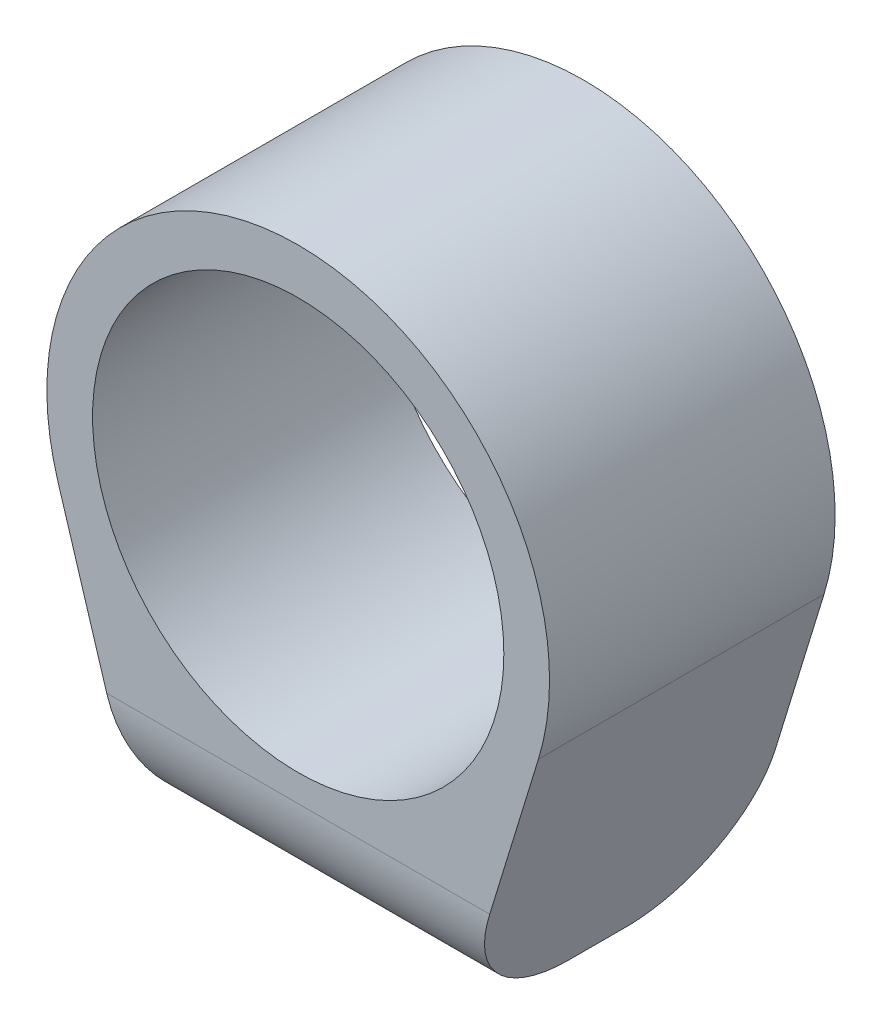
ISO-10303-21;
HEADER;
FILE_DESCRIPTION(('STEP AP214'),'2;1');
FILE_NAME('part.step','',(''),(''),'','','');
FILE_SCHEMA(('AUTOMOTIVE_DESIGN { 1 0 10303 214 1 1 1 1 }'));
ENDSEC;
DATA;
#1=APPLICATION_CONTEXT('core data for automotive mechanical design processes');
#2=APPLICATION_PROTOCOL_DEFINITION('international standard','automotive_design',2000,#1);
#3=PRODUCT_CONTEXT('',#1,'mechanical');
#4=PRODUCT('Part','Part','',(#3));
#5=PRODUCT_RELATED_PRODUCT_CATEGORY('part','',(#4));
#6=PRODUCT_DEFINITION_FORMATION('','',#4);
#7=PRODUCT_DEFINITION_CONTEXT('part definition',#1,'design');
#8=PRODUCT_DEFINITION('design','',#6,#7);
#9=PRODUCT_DEFINITION_SHAPE('','',#8);
#10=(LENGTH_UNIT() NAMED_UNIT(*) SI_UNIT(.MILLI.,.METRE.));
#11=(NAMED_UNIT(*) PLANE_ANGLE_UNIT() SI_UNIT($,.RADIAN.));
#12=(NAMED_UNIT(*) SI_UNIT($,.STERADIAN.) SOLID_ANGLE_UNIT());
#13=UNCERTAINTY_MEASURE_WITH_UNIT(LENGTH_MEASURE(1.E-05),#10,'distance_accuracy_value','');
#14=(GEOMETRIC_REPRESENTATION_CONTEXT(3) GLOBAL_UNCERTAINTY_ASSIGNED_CONTEXT((#13)) GLOBAL_UNIT_ASSIGNED_CONTEXT((#10,
#11,#12)) REPRESENTATION_CONTEXT('',''));
#15=CARTESIAN_POINT('',(0.,0.,0.));
#16=DIRECTION('',(0.,0.,1.));
#17=DIRECTION('',(1.,0.,0.));
#18=AXIS2_PLACEMENT_3D('',#15,#16,#17);
#19=CARTESIAN_POINT('',(-13.6950192477342,-30.3553363974803,25.));
#20=DIRECTION('',(0.,1.,0.));
#21=DIRECTION('',(-1.,0.,0.));
#22=AXIS2_PLACEMENT_3D('',#19,#20,#21);
#23=PLANE('',#22);
#24=DIRECTION('',(0.,0.,-1.));
#25=VECTOR('',#24,1.);
#26=CARTESIAN_POINT('',(-13.6950192477342,-30.3553363974803,25.));
#27=LINE('',#26,#25);
#28=CARTESIAN_POINT('',(-13.6950192477342,-30.3553363974803,15.));
#29=VERTEX_POINT('',#28);
#30=CARTESIAN_POINT('',(-13.6950192477342,-30.3553363974803,10.));
#31=VERTEX_POINT('',#30);
#32=EDGE_CURVE('E122',#29,#31,#27,.T.);
#33=ORIENTED_EDGE('',*,*,#32,.T.);
#34=DIRECTION('',(1.,0.,0.));
#35=VECTOR('',#34,1.);
#36=CARTESIAN_POINT('',(-13.6950192477342,-30.3553363974803,10.));
#37=LINE('',#36,#35);
#38=CARTESIAN_POINT('',(-4.5,-30.3553363974803,10.));
#39=VERTEX_POINT('',#38);
#40=EDGE_CURVE('E138',#31,#39,#37,.T.);
#41=ORIENTED_EDGE('',*,*,#40,.T.);
#42=CARTESIAN_POINT('',(-4.5,-30.3553363974803,12.5));
#43=DIRECTION('',(0.,-1.,0.));
#44=DIRECTION('',(1.,0.,0.));
#45=AXIS2_PLACEMENT_3D('',#42,#43,#44);
#46=CIRCLE('',#45,2.5);
#47=CARTESIAN_POINT('',(-4.5,-30.3553363974803,15.));
#48=VERTEX_POINT('',#47);
#49=EDGE_CURVE('E199',#48,#39,#46,.T.);
#50=ORIENTED_EDGE('',*,*,#49,.F.);
#51=DIRECTION('',(1.,0.,0.));
#52=VECTOR('',#51,1.);
#53=CARTESIAN_POINT('',(-13.6950192477342,-30.3553363974803,15.));
#54=LINE('',#53,#52);
#55=EDGE_CURVE('E121',#48,#29,#54,.F.);
#56=ORIENTED_EDGE('',*,*,#55,.T.);
#57=EDGE_LOOP('',(#33,#41,#50,#56));
#58=FACE_BOUND('',#57,.T.);
#59=ADVANCED_FACE('F33',(#58),#23,.F.);
#60=EDGE_CURVE('E165',#39,#48,#46,.T.);
#61=ORIENTED_EDGE('',*,*,#60,.F.);
#62=DIRECTION('',(1.,0.,0.));
#63=VECTOR('',#62,1.);
#64=CARTESIAN_POINT('',(-13.6950192477342,-30.3553363974803,10.));
#65=LINE('',#64,#63);
#66=CARTESIAN_POINT('',(4.5,-30.3553363974803,10.));
#67=VERTEX_POINT('',#66);
#68=EDGE_CURVE('E136',#39,#67,#65,.T.);
#69=ORIENTED_EDGE('',*,*,#68,.T.);
#70=CARTESIAN_POINT('',(4.5,-30.3553363974803,12.5));
#71=DIRECTION('',(0.,-1.,0.));
#72=DIRECTION('',(1.,0.,0.));
#73=AXIS2_PLACEMENT_3D('',#70,#71,#72);
#74=CIRCLE('',#73,2.5);
#75=CARTESIAN_POINT('',(4.5,-30.3553363974803,15.));
#76=VERTEX_POINT('',#75);
#77=EDGE_CURVE('E162',#76,#67,#74,.T.);
#78=ORIENTED_EDGE('',*,*,#77,.F.);
#79=DIRECTION('',(1.,0.,0.));
#80=VECTOR('',#79,1.);
#81=CARTESIAN_POINT('',(-13.6950192477342,-30.3553363974803,15.));
#82=LINE('',#81,#80);
#83=EDGE_CURVE('E124',#76,#48,#82,.F.);
#84=ORIENTED_EDGE('',*,*,#83,.T.);
#85=EDGE_LOOP('',(#61,#69,#78,#84));
#86=FACE_BOUND('',#85,.T.);
#87=ADVANCED_FACE('F160',(#86),#23,.F.);
#88=CARTESIAN_POINT('',(0.,0.,25.));
#89=DIRECTION('',(0.,0.,1.));
#90=DIRECTION('',(1.,0.,0.));
#91=AXIS2_PLACEMENT_3D('',#88,#89,#90);
#92=PLANE('',#91);
#93=DIRECTION('',(0.293455292652128,-0.955972798365337,0.));
#94=VECTOR('',#93,1.);
#95=CARTESIAN_POINT('',(-21.0314015640374,-6.45601643834682,25.));
#96=LINE('',#95,#94);
#97=CARTESIAN_POINT('',(-21.0314015640374,-6.45601643834682,25.));
#98=VERTEX_POINT('',#97);
#99=CARTESIAN_POINT('',(-16.7647226237499,-20.3553363974803,25.));
#100=VERTEX_POINT('',#99);
#101=EDGE_CURVE('E98',#98,#100,#96,.T.);
#102=ORIENTED_EDGE('',*,*,#101,.T.);
#103=DIRECTION('',(1.,0.,0.));
#104=VECTOR('',#103,1.);
#105=CARTESIAN_POINT('',(13.6950192477342,-20.3553363974803,25.));
#106=LINE('',#105,#104);
#107=CARTESIAN_POINT('',(16.7647226237499,-20.3553363974803,25.));
#108=VERTEX_POINT('',#107);
#109=EDGE_CURVE('E11',#100,#108,#106,.T.);
#110=ORIENTED_EDGE('',*,*,#109,.T.);
#111=DIRECTION('',(0.293455292652128,0.955972798365337,0.));
#112=VECTOR('',#111,1.);
#113=CARTESIAN_POINT('',(21.0314015640374,-6.45601643834682,25.));
#114=LINE('',#113,#112);
#115=CARTESIAN_POINT('',(21.0314015640374,-6.45601643834682,25.));
#116=VERTEX_POINT('',#115);
#117=EDGE_CURVE('E106',#108,#116,#114,.T.);
#118=ORIENTED_EDGE('',*,*,#117,.T.);
#119=CARTESIAN_POINT('',(0.,0.,25.));
#120=DIRECTION('',(0.,0.,1.));
#121=DIRECTION('',(1.,0.,0.));
#122=AXIS2_PLACEMENT_3D('',#119,#120,#121);
#123=CIRCLE('',#122,22.);
#124=EDGE_CURVE('E107',#116,#98,#123,.T.);
#125=ORIENTED_EDGE('',*,*,#124,.T.);
#126=EDGE_LOOP('',(#102,#110,#118,#125));
#127=FACE_BOUND('',#126,.T.);
#128=CARTESIAN_POINT('',(0.,0.,25.));
#129=DIRECTION('',(0.,0.,1.));
#130=DIRECTION('',(1.,0.,0.));
#131=AXIS2_PLACEMENT_3D('',#128,#129,#130);
#132=CIRCLE('',#131,18.);
#133=CARTESIAN_POINT('',(18.,0.,25.));
#134=VERTEX_POINT('',#133);
#135=EDGE_CURVE('E182',#134,#134,#132,.T.);
#136=ORIENTED_EDGE('',*,*,#135,.F.);
#137=EDGE_LOOP('',(#136));
#138=FACE_BOUND('',#137,.T.);
#139=ADVANCED_FACE('F110',(#127,#138),#92,.T.);
#140=CARTESIAN_POINT('',(0.,0.,0.));
#141=DIRECTION('',(0.,0.,1.));
#142=DIRECTION('',(1.,0.,0.));
#143=AXIS2_PLACEMENT_3D('',#140,#141,#142);
#144=PLANE('',#143);
#145=DIRECTION('',(0.293455292652128,0.955972798365337,0.));
#146=VECTOR('',#145,1.);
#147=CARTESIAN_POINT('',(21.0314015640374,-6.45601643834682,0.));
#148=LINE('',#147,#146);
#149=CARTESIAN_POINT('',(16.7647226237499,-20.3553363974803,0.));
#150=VERTEX_POINT('',#149);
#151=CARTESIAN_POINT('',(21.0314015640374,-6.45601643834682,0.));
#152=VERTEX_POINT('',#151);
#153=EDGE_CURVE('E116',#150,#152,#148,.T.);
#154=ORIENTED_EDGE('',*,*,#153,.F.);
#155=DIRECTION('',(1.,0.,0.));
#156=VECTOR('',#155,1.);
#157=CARTESIAN_POINT('',(0.,-20.3553363974803,0.));
#158=LINE('',#157,#156);
#159=CARTESIAN_POINT('',(-16.7647226237499,-20.3553363974803,0.));
#160=VERTEX_POINT('',#159);
#161=EDGE_CURVE('E56',#150,#160,#158,.F.);
#162=ORIENTED_EDGE('',*,*,#161,.T.);
#163=DIRECTION('',(0.293455292652128,-0.955972798365337,0.));
#164=VECTOR('',#163,1.);
#165=CARTESIAN_POINT('',(-21.0314015640374,-6.45601643834682,0.));
#166=LINE('',#165,#164);
#167=CARTESIAN_POINT('',(-21.0314015640374,-6.45601643834682,0.));
#168=VERTEX_POINT('',#167);
#169=EDGE_CURVE('E147',#168,#160,#166,.T.);
#170=ORIENTED_EDGE('',*,*,#169,.F.);
#171=CARTESIAN_POINT('',(0.,0.,0.));
#172=DIRECTION('',(0.,0.,1.));
#173=DIRECTION('',(1.,0.,0.));
#174=AXIS2_PLACEMENT_3D('',#171,#172,#173);
#175=CIRCLE('',#174,22.);
#176=EDGE_CURVE('E120',#152,#168,#175,.T.);
#177=ORIENTED_EDGE('',*,*,#176,.F.);
#178=EDGE_LOOP('',(#154,#162,#170,#177));
#179=FACE_BOUND('',#178,.T.);
#180=CARTESIAN_POINT('',(0.,0.,0.));
#181=DIRECTION('',(0.,0.,1.));
#182=DIRECTION('',(1.,0.,0.));
#183=AXIS2_PLACEMENT_3D('',#180,#181,#182);
#184=CIRCLE('',#183,18.);
#185=CARTESIAN_POINT('',(18.,0.,0.));
#186=VERTEX_POINT('',#185);
#187=EDGE_CURVE('E185',#186,#186,#184,.T.);
#188=ORIENTED_EDGE('',*,*,#187,.T.);
#189=EDGE_LOOP('',(#188));
#190=FACE_BOUND('',#189,.T.);
#191=ADVANCED_FACE('F232',(#179,#190),#144,.F.);
#192=CARTESIAN_POINT('',(0.,0.,25.));
#193=DIRECTION('',(0.,0.,-1.));
#194=DIRECTION('',(-1.,0.,0.));
#195=AXIS2_PLACEMENT_3D('',#192,#193,#194);
#196=CYLINDRICAL_SURFACE('',#195,22.);
#197=ORIENTED_EDGE('',*,*,#176,.T.);
#198=DIRECTION('',(0.,0.,-1.));
#199=VECTOR('',#198,1.);
#200=CARTESIAN_POINT('',(-21.0314015640374,-6.45601643834682,25.));
#201=LINE('',#200,#199);
#202=EDGE_CURVE('E102',#98,#168,#201,.T.);
#203=ORIENTED_EDGE('',*,*,#202,.F.);
#204=ORIENTED_EDGE('',*,*,#124,.F.);
#205=DIRECTION('',(0.,0.,-1.));
#206=VECTOR('',#205,1.);
#207=CARTESIAN_POINT('',(21.0314015640374,-6.45601643834682,25.));
#208=LINE('',#207,#206);
#209=EDGE_CURVE('E190',#116,#152,#208,.T.);
#210=ORIENTED_EDGE('',*,*,#209,.T.);
#211=EDGE_LOOP('',(#197,#203,#204,#210));
#212=FACE_BOUND('',#211,.T.);
#213=ADVANCED_FACE('F118',(#212),#196,.T.);
#214=CARTESIAN_POINT('',(-21.0314015640374,-6.45601643834682,25.));
#215=DIRECTION('',(0.955972798365337,0.293455292652128,0.));
#216=DIRECTION('',(-0.293455292652128,0.955972798365337,0.));
#217=AXIS2_PLACEMENT_3D('',#214,#215,#216);
#218=PLANE('',#217);
#219=ORIENTED_EDGE('',*,*,#169,.T.);
#220=CARTESIAN_POINT('',(-16.7647226237499,-20.3553363974803,10.));
#221=DIRECTION('',(0.955972798365337,0.293455292652128,0.));
#222=DIRECTION('',(0.293455292652128,-0.955972798365337,0.));
#223=AXIS2_PLACEMENT_3D('',#220,#221,#222);
#224=ELLIPSE('',#223,10.4605486862173,10.);
#225=EDGE_CURVE('E41',#160,#31,#224,.F.);
#226=ORIENTED_EDGE('',*,*,#225,.T.);
#227=ORIENTED_EDGE('',*,*,#32,.F.);
#228=CARTESIAN_POINT('',(-16.7647226237499,-20.3553363974803,15.));
#229=DIRECTION('',(0.955972798365337,0.293455292652128,0.));
#230=DIRECTION('',(-0.293455292652128,0.955972798365337,0.));
#231=AXIS2_PLACEMENT_3D('',#228,#229,#230);
#232=ELLIPSE('',#231,10.4605486862173,10.);
#233=EDGE_CURVE('E48',#29,#100,#232,.F.);
#234=ORIENTED_EDGE('',*,*,#233,.T.);
#235=ORIENTED_EDGE('',*,*,#101,.F.);
#236=ORIENTED_EDGE('',*,*,#202,.T.);
#237=EDGE_LOOP('',(#219,#226,#227,#234,#235,#236));
#238=FACE_BOUND('',#237,.T.);
#239=ADVANCED_FACE('F100',(#238),#218,.F.);
#240=EDGE_CURVE('E169',#67,#76,#74,.T.);
#241=ORIENTED_EDGE('',*,*,#240,.F.);
#242=DIRECTION('',(1.,0.,0.));
#243=VECTOR('',#242,1.);
#244=CARTESIAN_POINT('',(-13.6950192477342,-30.3553363974803,10.));
#245=LINE('',#244,#243);
#246=CARTESIAN_POINT('',(13.6950192477342,-30.3553363974803,10.));
#247=VERTEX_POINT('',#246);
#248=EDGE_CURVE('E134',#67,#247,#245,.T.);
#249=ORIENTED_EDGE('',*,*,#248,.T.);
#250=DIRECTION('',(0.,0.,-1.));
#251=VECTOR('',#250,1.);
#252=CARTESIAN_POINT('',(13.6950192477342,-30.3553363974803,25.));
#253=LINE('',#252,#251);
#254=CARTESIAN_POINT('',(13.6950192477342,-30.3553363974803,15.));
#255=VERTEX_POINT('',#254);
#256=EDGE_CURVE('E127',#255,#247,#253,.T.);
#257=ORIENTED_EDGE('',*,*,#256,.F.);
#258=DIRECTION('',(1.,0.,0.));
#259=VECTOR('',#258,1.);
#260=CARTESIAN_POINT('',(-13.6950192477342,-30.3553363974803,15.));
#261=LINE('',#260,#259);
#262=EDGE_CURVE('E132',#255,#76,#261,.F.);
#263=ORIENTED_EDGE('',*,*,#262,.T.);
#264=EDGE_LOOP('',(#241,#249,#257,#263));
#265=FACE_BOUND('',#264,.T.);
#266=ADVANCED_FACE('F170',(#265),#23,.F.);
#267=CARTESIAN_POINT('',(21.0314015640374,-6.45601643834682,25.));
#268=DIRECTION('',(-0.955972798365337,0.293455292652128,0.));
#269=DIRECTION('',(-0.293455292652128,-0.955972798365337,0.));
#270=AXIS2_PLACEMENT_3D('',#267,#268,#269);
#271=PLANE('',#270);
#272=ORIENTED_EDGE('',*,*,#256,.T.);
#273=CARTESIAN_POINT('',(16.76472262375,-20.3553363974802,10.));
#274=DIRECTION('',(-0.955972798365337,0.293455292652128,0.));
#275=DIRECTION('',(0.293455292652128,0.955972798365337,0.));
#276=AXIS2_PLACEMENT_3D('',#273,#274,#275);
#277=ELLIPSE('',#276,10.4605486862173,10.);
#278=EDGE_CURVE('E143',#247,#150,#277,.F.);
#279=ORIENTED_EDGE('',*,*,#278,.T.);
#280=ORIENTED_EDGE('',*,*,#153,.T.);
#281=ORIENTED_EDGE('',*,*,#209,.F.);
#282=ORIENTED_EDGE('',*,*,#117,.F.);
#283=CARTESIAN_POINT('',(16.7647226237499,-20.3553363974802,15.));
#284=DIRECTION('',(-0.955972798365337,0.293455292652128,0.));
#285=DIRECTION('',(-0.293455292652128,-0.955972798365337,0.));
#286=AXIS2_PLACEMENT_3D('',#283,#284,#285);
#287=ELLIPSE('',#286,10.4605486862173,10.);
#288=EDGE_CURVE('E141',#108,#255,#287,.F.);
#289=ORIENTED_EDGE('',*,*,#288,.T.);
#290=EDGE_LOOP('',(#272,#279,#280,#281,#282,#289));
#291=FACE_BOUND('',#290,.T.);
#292=ADVANCED_FACE('F195',(#291),#271,.F.);
#293=CARTESIAN_POINT('',(0.,0.,25.));
#294=DIRECTION('',(0.,0.,-1.));
#295=DIRECTION('',(-1.,0.,0.));
#296=AXIS2_PLACEMENT_3D('',#293,#294,#295);
#297=CYLINDRICAL_SURFACE('',#296,18.);
#298=ORIENTED_EDGE('',*,*,#135,.T.);
#299=EDGE_LOOP('',(#298));
#300=FACE_BOUND('',#299,.T.);
#301=ORIENTED_EDGE('',*,*,#187,.F.);
#302=EDGE_LOOP('',(#301));
#303=FACE_BOUND('',#302,.T.);
#304=ADVANCED_FACE('F228',(#300,#303),#297,.F.);
#305=CARTESIAN_POINT('',(4.5,-20.3553363974803,12.5));
#306=DIRECTION('',(0.,-1.,0.));
#307=DIRECTION('',(1.,0.,0.));
#308=AXIS2_PLACEMENT_3D('',#305,#306,#307);
#309=CYLINDRICAL_SURFACE('',#308,2.5);
#310=CARTESIAN_POINT('',(4.5,-20.3553363974803,12.5));
#311=DIRECTION('',(0.,-1.,0.));
#312=DIRECTION('',(1.,0.,0.));
#313=AXIS2_PLACEMENT_3D('',#310,#311,#312);
#314=CIRCLE('',#313,2.5);
#315=CARTESIAN_POINT('',(7.,-20.3553363974803,12.5));
#316=VERTEX_POINT('',#315);
#317=EDGE_CURVE('E177',#316,#316,#314,.T.);
#318=ORIENTED_EDGE('',*,*,#317,.F.);
#319=EDGE_LOOP('',(#318));
#320=FACE_BOUND('',#319,.T.);
#321=ORIENTED_EDGE('',*,*,#77,.T.);
#322=ORIENTED_EDGE('',*,*,#240,.T.);
#323=EDGE_LOOP('',(#321,#322));
#324=FACE_BOUND('',#323,.T.);
#325=ADVANCED_FACE('F176',(#320,#324),#309,.F.);
#326=CARTESIAN_POINT('',(0.,-20.3553363974803,0.));
#327=DIRECTION('',(0.,-1.,0.));
#328=DIRECTION('',(1.,0.,0.));
#329=AXIS2_PLACEMENT_3D('',#326,#327,#328);
#330=PLANE('',#329);
#331=ORIENTED_EDGE('',*,*,#317,.T.);
#332=EDGE_LOOP('',(#331));
#333=FACE_BOUND('',#332,.T.);
#334=ADVANCED_FACE('F207',(#333),#330,.T.);
#335=CARTESIAN_POINT('',(-4.5,-20.3553363974803,12.5));
#336=DIRECTION('',(0.,-1.,0.));
#337=DIRECTION('',(1.,0.,0.));
#338=AXIS2_PLACEMENT_3D('',#335,#336,#337);
#339=CYLINDRICAL_SURFACE('',#338,2.5);
#340=CARTESIAN_POINT('',(-4.5,-20.3553363974803,12.5));
#341=DIRECTION('',(0.,-1.,0.));
#342=DIRECTION('',(1.,0.,0.));
#343=AXIS2_PLACEMENT_3D('',#340,#341,#342);
#344=CIRCLE('',#343,2.5);
#345=CARTESIAN_POINT('',(-1.99999999999999,-20.3553363974803,12.5));
#346=VERTEX_POINT('',#345);
#347=EDGE_CURVE('E187',#346,#346,#344,.T.);
#348=ORIENTED_EDGE('',*,*,#347,.F.);
#349=EDGE_LOOP('',(#348));
#350=FACE_BOUND('',#349,.T.);
#351=ORIENTED_EDGE('',*,*,#49,.T.);
#352=ORIENTED_EDGE('',*,*,#60,.T.);
#353=EDGE_LOOP('',(#351,#352));
#354=FACE_BOUND('',#353,.T.);
#355=ADVANCED_FACE('F198',(#350,#354),#339,.F.);
#356=CARTESIAN_POINT('',(0.,-20.3553363974803,0.));
#357=DIRECTION('',(0.,-1.,0.));
#358=DIRECTION('',(1.,0.,0.));
#359=AXIS2_PLACEMENT_3D('',#356,#357,#358);
#360=PLANE('',#359);
#361=ORIENTED_EDGE('',*,*,#347,.T.);
#362=EDGE_LOOP('',(#361));
#363=FACE_BOUND('',#362,.T.);
#364=ADVANCED_FACE('F204',(#363),#360,.T.);
#365=CARTESIAN_POINT('',(-13.6950192477342,-20.3553363974803,10.));
#366=DIRECTION('',(1.,0.,0.));
#367=DIRECTION('',(0.,1.,0.));
#368=AXIS2_PLACEMENT_3D('',#365,#366,#367);
#369=CYLINDRICAL_SURFACE('',#368,10.);
#370=ORIENTED_EDGE('',*,*,#225,.F.);
#371=ORIENTED_EDGE('',*,*,#161,.F.);
#372=ORIENTED_EDGE('',*,*,#278,.F.);
#373=ORIENTED_EDGE('',*,*,#248,.F.);
#374=ORIENTED_EDGE('',*,*,#68,.F.);
#375=ORIENTED_EDGE('',*,*,#40,.F.);
#376=EDGE_LOOP('',(#370,#371,#372,#373,#374,#375));
#377=FACE_BOUND('',#376,.T.);
#378=ADVANCED_FACE('F154',(#377),#369,.T.);
#379=CARTESIAN_POINT('',(0.,-20.3553363974803,15.));
#380=DIRECTION('',(-1.,0.,0.));
#381=DIRECTION('',(0.,-1.,0.));
#382=AXIS2_PLACEMENT_3D('',#379,#380,#381);
#383=CYLINDRICAL_SURFACE('',#382,10.);
#384=ORIENTED_EDGE('',*,*,#83,.F.);
#385=ORIENTED_EDGE('',*,*,#262,.F.);
#386=ORIENTED_EDGE('',*,*,#288,.F.);
#387=ORIENTED_EDGE('',*,*,#109,.F.);
#388=ORIENTED_EDGE('',*,*,#233,.F.);
#389=ORIENTED_EDGE('',*,*,#55,.F.);
#390=EDGE_LOOP('',(#384,#385,#386,#387,#388,#389));
#391=FACE_BOUND('',#390,.T.);
#392=ADVANCED_FACE('F35',(#391),#383,.T.);
#393=CLOSED_SHELL('',(#59,#87,#139,#191,#213,#239,#266,#292,#304,#325,#334,#355,#364,#378,#392));
#394=MANIFOLD_SOLID_BREP('B2',#393);
#395=ADVANCED_BREP_SHAPE_REPRESENTATION('',(#18,#394),#14);
#396=SHAPE_DEFINITION_REPRESENTATION(#9,#395);
ENDSEC;
END-ISO-10303-21;
